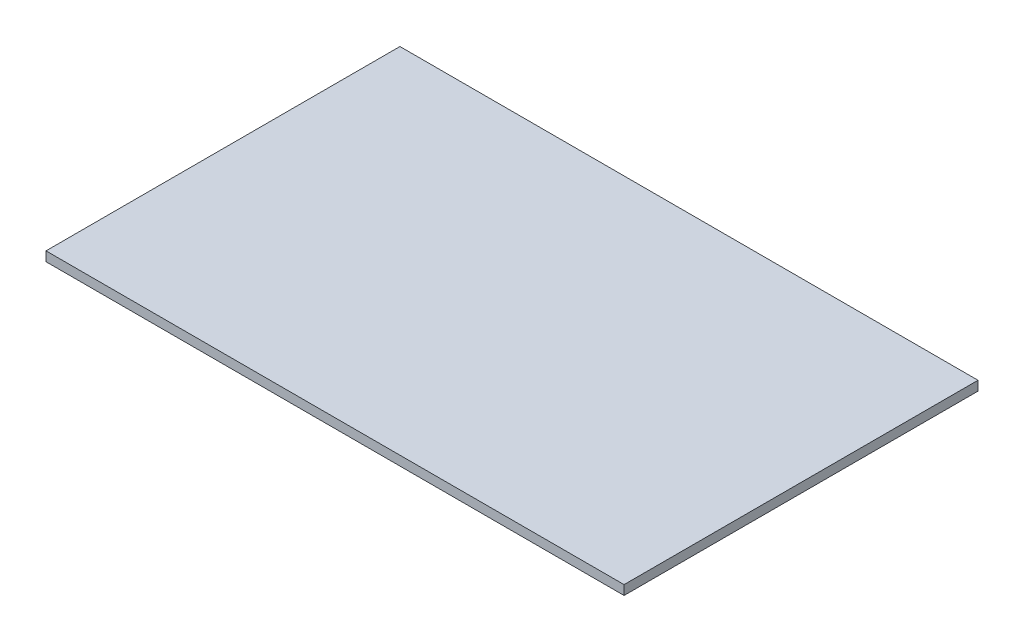
ISO-10303-21;
HEADER;
FILE_DESCRIPTION(('STEP AP214'),'2;1');
FILE_NAME('part.step','',(''),(''),'','','');
FILE_SCHEMA(('AUTOMOTIVE_DESIGN { 1 0 10303 214 1 1 1 1 }'));
ENDSEC;
DATA;
#1=APPLICATION_CONTEXT('core data for automotive mechanical design processes');
#2=APPLICATION_PROTOCOL_DEFINITION('international standard','automotive_design',2000,#1);
#3=PRODUCT_CONTEXT('',#1,'mechanical');
#4=PRODUCT('Part','Part','',(#3));
#5=PRODUCT_RELATED_PRODUCT_CATEGORY('part','',(#4));
#6=PRODUCT_DEFINITION_FORMATION('','',#4);
#7=PRODUCT_DEFINITION_CONTEXT('part definition',#1,'design');
#8=PRODUCT_DEFINITION('design','',#6,#7);
#9=PRODUCT_DEFINITION_SHAPE('','',#8);
#10=(LENGTH_UNIT() NAMED_UNIT(*) SI_UNIT(.MILLI.,.METRE.));
#11=(NAMED_UNIT(*) PLANE_ANGLE_UNIT() SI_UNIT($,.RADIAN.));
#12=(NAMED_UNIT(*) SI_UNIT($,.STERADIAN.) SOLID_ANGLE_UNIT());
#13=UNCERTAINTY_MEASURE_WITH_UNIT(LENGTH_MEASURE(1.E-05),#10,'distance_accuracy_value','');
#14=(GEOMETRIC_REPRESENTATION_CONTEXT(3) GLOBAL_UNCERTAINTY_ASSIGNED_CONTEXT((#13)) GLOBAL_UNIT_ASSIGNED_CONTEXT((#10,
#11,#12)) REPRESENTATION_CONTEXT('',''));
#15=CARTESIAN_POINT('',(0.,0.,0.));
#16=DIRECTION('',(0.,0.,1.));
#17=DIRECTION('',(1.,0.,0.));
#18=AXIS2_PLACEMENT_3D('',#15,#16,#17);
#19=CARTESIAN_POINT('',(-122.5,4.,-75.));
#20=DIRECTION('',(1.,0.,0.));
#21=DIRECTION('',(0.,0.,-1.));
#22=AXIS2_PLACEMENT_3D('',#19,#20,#21);
#23=PLANE('',#22);
#24=DIRECTION('',(0.,0.,1.));
#25=VECTOR('',#24,1.);
#26=CARTESIAN_POINT('',(-122.5,0.,-75.));
#27=LINE('',#26,#25);
#28=CARTESIAN_POINT('',(-122.5,0.,-75.));
#29=VERTEX_POINT('',#28);
#30=CARTESIAN_POINT('',(-122.5,0.,75.));
#31=VERTEX_POINT('',#30);
#32=EDGE_CURVE('E121',#29,#31,#27,.T.);
#33=ORIENTED_EDGE('',*,*,#32,.T.);
#34=DIRECTION('',(0.,-1.,0.));
#35=VECTOR('',#34,1.);
#36=CARTESIAN_POINT('',(-122.5,4.,75.));
#37=LINE('',#36,#35);
#38=CARTESIAN_POINT('',(-122.5,4.,75.));
#39=VERTEX_POINT('',#38);
#40=EDGE_CURVE('E12',#39,#31,#37,.T.);
#41=ORIENTED_EDGE('',*,*,#40,.F.);
#42=DIRECTION('',(0.,0.,1.));
#43=VECTOR('',#42,1.);
#44=CARTESIAN_POINT('',(-122.5,4.,-75.));
#45=LINE('',#44,#43);
#46=CARTESIAN_POINT('',(-122.5,4.,-75.));
#47=VERTEX_POINT('',#46);
#48=EDGE_CURVE('E90',#47,#39,#45,.T.);
#49=ORIENTED_EDGE('',*,*,#48,.F.);
#50=DIRECTION('',(0.,-1.,0.));
#51=VECTOR('',#50,1.);
#52=CARTESIAN_POINT('',(-122.5,4.,-75.));
#53=LINE('',#52,#51);
#54=EDGE_CURVE('E101',#47,#29,#53,.T.);
#55=ORIENTED_EDGE('',*,*,#54,.T.);
#56=EDGE_LOOP('',(#33,#41,#49,#55));
#57=FACE_BOUND('',#56,.T.);
#58=ADVANCED_FACE('F39',(#57),#23,.F.);
#59=CARTESIAN_POINT('',(122.5,4.,75.));
#60=DIRECTION('',(0.,0.,-1.));
#61=DIRECTION('',(-1.,0.,0.));
#62=AXIS2_PLACEMENT_3D('',#59,#60,#61);
#63=PLANE('',#62);
#64=DIRECTION('',(1.,0.,0.));
#65=VECTOR('',#64,1.);
#66=CARTESIAN_POINT('',(122.5,0.,75.));
#67=LINE('',#66,#65);
#68=CARTESIAN_POINT('',(122.5,0.,75.));
#69=VERTEX_POINT('',#68);
#70=EDGE_CURVE('E95',#31,#69,#67,.T.);
#71=ORIENTED_EDGE('',*,*,#70,.T.);
#72=DIRECTION('',(0.,-1.,0.));
#73=VECTOR('',#72,1.);
#74=CARTESIAN_POINT('',(122.5,4.,75.));
#75=LINE('',#74,#73);
#76=CARTESIAN_POINT('',(122.5,4.,75.));
#77=VERTEX_POINT('',#76);
#78=EDGE_CURVE('E47',#77,#69,#75,.T.);
#79=ORIENTED_EDGE('',*,*,#78,.F.);
#80=DIRECTION('',(1.,0.,0.));
#81=VECTOR('',#80,1.);
#82=CARTESIAN_POINT('',(122.5,4.,75.));
#83=LINE('',#82,#81);
#84=EDGE_CURVE('E85',#39,#77,#83,.T.);
#85=ORIENTED_EDGE('',*,*,#84,.F.);
#86=ORIENTED_EDGE('',*,*,#40,.T.);
#87=EDGE_LOOP('',(#71,#79,#85,#86));
#88=FACE_BOUND('',#87,.T.);
#89=ADVANCED_FACE('F94',(#88),#63,.F.);
#90=CARTESIAN_POINT('',(122.5,4.,-75.));
#91=DIRECTION('',(-1.,0.,0.));
#92=DIRECTION('',(0.,0.,1.));
#93=AXIS2_PLACEMENT_3D('',#90,#91,#92);
#94=PLANE('',#93);
#95=DIRECTION('',(0.,0.,-1.));
#96=VECTOR('',#95,1.);
#97=CARTESIAN_POINT('',(122.5,0.,-75.));
#98=LINE('',#97,#96);
#99=CARTESIAN_POINT('',(122.5,0.,-75.));
#100=VERTEX_POINT('',#99);
#101=EDGE_CURVE('E72',#69,#100,#98,.T.);
#102=ORIENTED_EDGE('',*,*,#101,.T.);
#103=DIRECTION('',(0.,-1.,0.));
#104=VECTOR('',#103,1.);
#105=CARTESIAN_POINT('',(122.5,4.,-75.));
#106=LINE('',#105,#104);
#107=CARTESIAN_POINT('',(122.5,4.,-75.));
#108=VERTEX_POINT('',#107);
#109=EDGE_CURVE('E96',#108,#100,#106,.T.);
#110=ORIENTED_EDGE('',*,*,#109,.F.);
#111=DIRECTION('',(0.,0.,-1.));
#112=VECTOR('',#111,1.);
#113=CARTESIAN_POINT('',(122.5,4.,-75.));
#114=LINE('',#113,#112);
#115=EDGE_CURVE('E88',#77,#108,#114,.T.);
#116=ORIENTED_EDGE('',*,*,#115,.F.);
#117=ORIENTED_EDGE('',*,*,#78,.T.);
#118=EDGE_LOOP('',(#102,#110,#116,#117));
#119=FACE_BOUND('',#118,.T.);
#120=ADVANCED_FACE('F97',(#119),#94,.F.);
#121=CARTESIAN_POINT('',(122.5,4.,-75.));
#122=DIRECTION('',(0.,0.,1.));
#123=DIRECTION('',(1.,0.,0.));
#124=AXIS2_PLACEMENT_3D('',#121,#122,#123);
#125=PLANE('',#124);
#126=DIRECTION('',(-1.,0.,0.));
#127=VECTOR('',#126,1.);
#128=CARTESIAN_POINT('',(122.5,0.,-75.));
#129=LINE('',#128,#127);
#130=EDGE_CURVE('E78',#100,#29,#129,.T.);
#131=ORIENTED_EDGE('',*,*,#130,.T.);
#132=ORIENTED_EDGE('',*,*,#54,.F.);
#133=DIRECTION('',(-1.,0.,0.));
#134=VECTOR('',#133,1.);
#135=CARTESIAN_POINT('',(122.5,4.,-75.));
#136=LINE('',#135,#134);
#137=EDGE_CURVE('E55',#108,#47,#136,.T.);
#138=ORIENTED_EDGE('',*,*,#137,.F.);
#139=ORIENTED_EDGE('',*,*,#109,.T.);
#140=EDGE_LOOP('',(#131,#132,#138,#139));
#141=FACE_BOUND('',#140,.T.);
#142=ADVANCED_FACE('F116',(#141),#125,.F.);
#143=CARTESIAN_POINT('',(0.,4.,0.));
#144=DIRECTION('',(0.,-1.,0.));
#145=DIRECTION('',(0.,0.,-1.));
#146=AXIS2_PLACEMENT_3D('',#143,#144,#145);
#147=PLANE('',#146);
#148=ORIENTED_EDGE('',*,*,#48,.T.);
#149=ORIENTED_EDGE('',*,*,#84,.T.);
#150=ORIENTED_EDGE('',*,*,#115,.T.);
#151=ORIENTED_EDGE('',*,*,#137,.T.);
#152=EDGE_LOOP('',(#148,#149,#150,#151));
#153=FACE_BOUND('',#152,.T.);
#154=ADVANCED_FACE('F86',(#153),#147,.F.);
#155=CARTESIAN_POINT('',(0.,0.,0.));
#156=DIRECTION('',(0.,-1.,0.));
#157=DIRECTION('',(0.,0.,-1.));
#158=AXIS2_PLACEMENT_3D('',#155,#156,#157);
#159=PLANE('',#158);
#160=ORIENTED_EDGE('',*,*,#32,.F.);
#161=ORIENTED_EDGE('',*,*,#130,.F.);
#162=ORIENTED_EDGE('',*,*,#101,.F.);
#163=ORIENTED_EDGE('',*,*,#70,.F.);
#164=EDGE_LOOP('',(#160,#161,#162,#163));
#165=FACE_BOUND('',#164,.T.);
#166=ADVANCED_FACE('F119',(#165),#159,.T.);
#167=CLOSED_SHELL('',(#58,#89,#120,#142,#154,#166));
#168=MANIFOLD_SOLID_BREP('B2',#167);
#169=ADVANCED_BREP_SHAPE_REPRESENTATION('',(#18,#168),#14);
#170=SHAPE_DEFINITION_REPRESENTATION(#9,#169);
ENDSEC;
END-ISO-10303-21;
